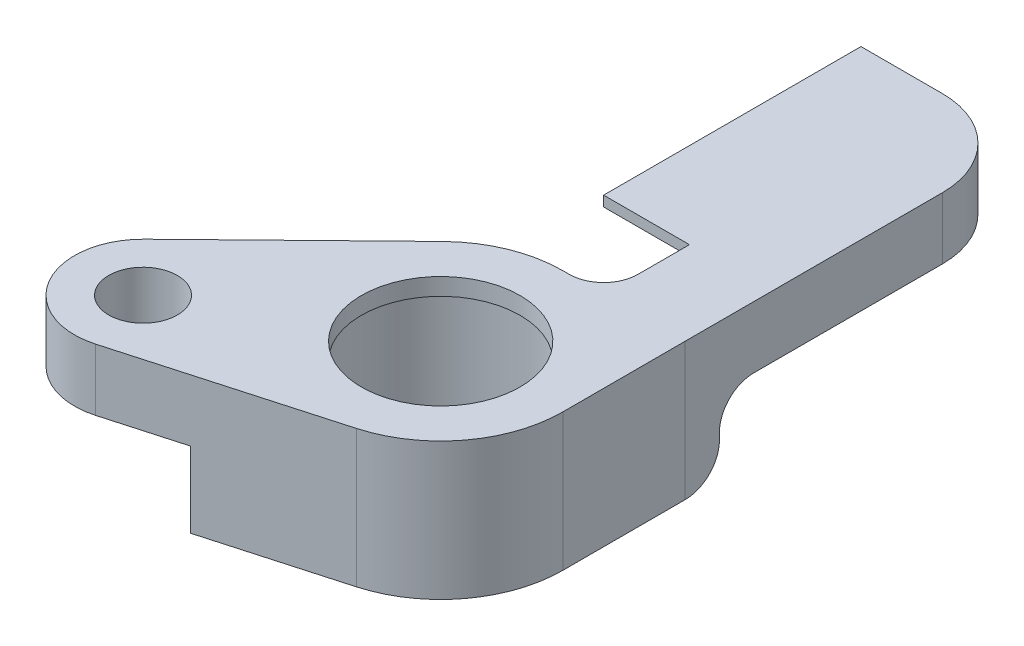
ISO-10303-21;
HEADER;
FILE_DESCRIPTION(('STEP AP214'),'2;1');
FILE_NAME('part.step','',(''),(''),'','','');
FILE_SCHEMA(('AUTOMOTIVE_DESIGN { 1 0 10303 214 1 1 1 1 }'));
ENDSEC;
DATA;
#1=APPLICATION_CONTEXT('core data for automotive mechanical design processes');
#2=APPLICATION_PROTOCOL_DEFINITION('international standard','automotive_design',2000,#1);
#3=PRODUCT_CONTEXT('',#1,'mechanical');
#4=PRODUCT('Part','Part','',(#3));
#5=PRODUCT_RELATED_PRODUCT_CATEGORY('part','',(#4));
#6=PRODUCT_DEFINITION_FORMATION('','',#4);
#7=PRODUCT_DEFINITION_CONTEXT('part definition',#1,'design');
#8=PRODUCT_DEFINITION('design','',#6,#7);
#9=PRODUCT_DEFINITION_SHAPE('','',#8);
#10=(LENGTH_UNIT() NAMED_UNIT(*) SI_UNIT(.MILLI.,.METRE.));
#11=(NAMED_UNIT(*) PLANE_ANGLE_UNIT() SI_UNIT($,.RADIAN.));
#12=(NAMED_UNIT(*) SI_UNIT($,.STERADIAN.) SOLID_ANGLE_UNIT());
#13=UNCERTAINTY_MEASURE_WITH_UNIT(LENGTH_MEASURE(1.E-05),#10,'distance_accuracy_value','');
#14=(GEOMETRIC_REPRESENTATION_CONTEXT(3) GLOBAL_UNCERTAINTY_ASSIGNED_CONTEXT((#13)) GLOBAL_UNIT_ASSIGNED_CONTEXT((#10,
#11,#12)) REPRESENTATION_CONTEXT('',''));
#15=CARTESIAN_POINT('',(0.,0.,0.));
#16=DIRECTION('',(0.,0.,1.));
#17=DIRECTION('',(1.,0.,0.));
#18=AXIS2_PLACEMENT_3D('',#15,#16,#17);
#19=CARTESIAN_POINT('',(0.,16.,0.));
#20=DIRECTION('',(0.,-1.,0.));
#21=DIRECTION('',(0.,0.,-1.));
#22=AXIS2_PLACEMENT_3D('',#19,#20,#21);
#23=CYLINDRICAL_SURFACE('',#22,8.);
#24=CARTESIAN_POINT('',(0.,8.8,0.));
#25=DIRECTION('',(0.,-1.,0.));
#26=DIRECTION('',(0.,0.,-1.));
#27=AXIS2_PLACEMENT_3D('',#24,#25,#26);
#28=CIRCLE('',#27,8.);
#29=CARTESIAN_POINT('',(2.1725034572511,8.8,7.69936547568902));
#30=VERTEX_POINT('',#29);
#31=CARTESIAN_POINT('',(-5.58159436634202,8.8,-5.73112592163348));
#32=VERTEX_POINT('',#31);
#33=EDGE_CURVE('E229',#30,#32,#28,.T.);
#34=ORIENTED_EDGE('',*,*,#33,.F.);
#35=DIRECTION('',(0.,-1.,0.));
#36=VECTOR('',#35,1.);
#37=CARTESIAN_POINT('',(2.1725034572511,16.,7.69936547568901));
#38=LINE('',#37,#36);
#39=CARTESIAN_POINT('',(2.1725034572511,16.,7.69936547568901));
#40=VERTEX_POINT('',#39);
#41=EDGE_CURVE('E283',#40,#30,#38,.T.);
#42=ORIENTED_EDGE('',*,*,#41,.F.);
#43=CARTESIAN_POINT('',(0.,16.,0.));
#44=DIRECTION('',(0.,1.,0.));
#45=DIRECTION('',(0.,0.,1.));
#46=AXIS2_PLACEMENT_3D('',#43,#44,#45);
#47=CIRCLE('',#46,8.);
#48=CARTESIAN_POINT('',(-5.58159436634201,16.,-5.73112592163347));
#49=VERTEX_POINT('',#48);
#50=EDGE_CURVE('E250',#49,#40,#47,.T.);
#51=ORIENTED_EDGE('',*,*,#50,.F.);
#52=DIRECTION('',(0.,-1.,0.));
#53=VECTOR('',#52,1.);
#54=CARTESIAN_POINT('',(-5.58159436634201,16.,-5.73112592163347));
#55=LINE('',#54,#53);
#56=EDGE_CURVE('E286',#49,#32,#55,.T.);
#57=ORIENTED_EDGE('',*,*,#56,.T.);
#58=EDGE_LOOP('',(#34,#42,#51,#57));
#59=FACE_BOUND('',#58,.T.);
#60=ADVANCED_FACE('F35',(#59),#23,.T.);
#61=CARTESIAN_POINT('',(26.7433238904043,16.,-26.9517059221718));
#62=DIRECTION('',(1.,0.,0.));
#63=DIRECTION('',(0.,0.,-1.));
#64=AXIS2_PLACEMENT_3D('',#61,#62,#63);
#65=PLANE('',#64);
#66=DIRECTION('',(0.,0.,-1.));
#67=VECTOR('',#66,1.);
#68=CARTESIAN_POINT('',(26.7433238904043,14.8,-36.9517059221718));
#69=LINE('',#68,#67);
#70=CARTESIAN_POINT('',(26.7433238904043,14.8,-36.9517059221718));
#71=VERTEX_POINT('',#70);
#72=CARTESIAN_POINT('',(26.7433238904043,14.8,-66.9391980998909));
#73=VERTEX_POINT('',#72);
#74=EDGE_CURVE('E181',#71,#73,#69,.T.);
#75=ORIENTED_EDGE('',*,*,#74,.T.);
#76=DIRECTION('',(0.,-1.,0.));
#77=VECTOR('',#76,1.);
#78=CARTESIAN_POINT('',(26.7433238904043,14.8,-66.9391980998909));
#79=LINE('',#78,#77);
#80=CARTESIAN_POINT('',(26.7433238904043,8.8,-66.9391980998909));
#81=VERTEX_POINT('',#80);
#82=EDGE_CURVE('E462',#73,#81,#79,.T.);
#83=ORIENTED_EDGE('',*,*,#82,.T.);
#84=DIRECTION('',(0.,0.,-1.));
#85=VECTOR('',#84,1.);
#86=CARTESIAN_POINT('',(26.7433238904043,8.8,-66.9517059221718));
#87=LINE('',#86,#85);
#88=CARTESIAN_POINT('',(26.7433238904043,8.8,-34.9517059221718));
#89=VERTEX_POINT('',#88);
#90=EDGE_CURVE('E449',#89,#81,#87,.T.);
#91=ORIENTED_EDGE('',*,*,#90,.F.);
#92=CARTESIAN_POINT('',(26.7433238904043,4.8,-34.9517059221718));
#93=DIRECTION('',(1.,0.,0.));
#94=DIRECTION('',(0.,0.,-1.));
#95=AXIS2_PLACEMENT_3D('',#92,#93,#94);
#96=CIRCLE('',#95,4.);
#97=CARTESIAN_POINT('',(26.7433238904043,4.8,-30.9517059221718));
#98=VERTEX_POINT('',#97);
#99=EDGE_CURVE('E447',#89,#98,#96,.T.);
#100=ORIENTED_EDGE('',*,*,#99,.T.);
#101=DIRECTION('',(0.,-1.,0.));
#102=VECTOR('',#101,1.);
#103=CARTESIAN_POINT('',(26.7433238904043,16.,-30.9517059221718));
#104=LINE('',#103,#102);
#105=CARTESIAN_POINT('',(26.7433238904043,16.,-30.9517059221718));
#106=VERTEX_POINT('',#105);
#107=EDGE_CURVE('E300',#98,#106,#104,.F.);
#108=ORIENTED_EDGE('',*,*,#107,.T.);
#109=DIRECTION('',(0.,0.,1.));
#110=VECTOR('',#109,1.);
#111=CARTESIAN_POINT('',(26.7433238904043,16.,-26.9517059221718));
#112=LINE('',#111,#110);
#113=CARTESIAN_POINT('',(26.7433238904043,16.,-36.9517059221718));
#114=VERTEX_POINT('',#113);
#115=EDGE_CURVE('E240',#114,#106,#112,.T.);
#116=ORIENTED_EDGE('',*,*,#115,.F.);
#117=DIRECTION('',(0.,1.,0.));
#118=VECTOR('',#117,1.);
#119=CARTESIAN_POINT('',(26.7433238904043,14.8,-36.9517059221718));
#120=LINE('',#119,#118);
#121=EDGE_CURVE('E202',#71,#114,#120,.T.);
#122=ORIENTED_EDGE('',*,*,#121,.F.);
#123=EDGE_LOOP('',(#75,#83,#91,#100,#108,#116,#122));
#124=FACE_BOUND('',#123,.T.);
#125=ADVANCED_FACE('F329',(#124),#65,.F.);
#126=CARTESIAN_POINT('',(26.7433238904043,16.,-26.9517059221718));
#127=DIRECTION('',(0.,0.,1.));
#128=DIRECTION('',(1.,0.,0.));
#129=AXIS2_PLACEMENT_3D('',#126,#127,#128);
#130=PLANE('',#129);
#131=DIRECTION('',(-1.,0.,0.));
#132=VECTOR('',#131,1.);
#133=CARTESIAN_POINT('',(26.7433238904043,16.,-26.9517059221718));
#134=LINE('',#133,#132);
#135=CARTESIAN_POINT('',(22.7433238904043,16.,-26.9517059221718));
#136=VERTEX_POINT('',#135);
#137=CARTESIAN_POINT('',(22.,16.,-26.9517059221718));
#138=VERTEX_POINT('',#137);
#139=EDGE_CURVE('E243',#136,#138,#134,.T.);
#140=ORIENTED_EDGE('',*,*,#139,.F.);
#141=DIRECTION('',(0.,-1.,0.));
#142=VECTOR('',#141,1.);
#143=CARTESIAN_POINT('',(22.7433238904043,0.,-26.9517059221718));
#144=LINE('',#143,#142);
#145=CARTESIAN_POINT('',(22.7433238904043,0.,-26.9517059221718));
#146=VERTEX_POINT('',#145);
#147=EDGE_CURVE('E297',#136,#146,#144,.T.);
#148=ORIENTED_EDGE('',*,*,#147,.T.);
#149=DIRECTION('',(-1.,0.,0.));
#150=VECTOR('',#149,1.);
#151=CARTESIAN_POINT('',(26.7433238904043,0.,-26.9517059221718));
#152=LINE('',#151,#150);
#153=CARTESIAN_POINT('',(22.,0.,-26.9517059221718));
#154=VERTEX_POINT('',#153);
#155=EDGE_CURVE('E237',#146,#154,#152,.T.);
#156=ORIENTED_EDGE('',*,*,#155,.T.);
#157=DIRECTION('',(0.,-1.,0.));
#158=VECTOR('',#157,1.);
#159=CARTESIAN_POINT('',(22.,16.,-26.9517059221718));
#160=LINE('',#159,#158);
#161=EDGE_CURVE('E292',#138,#154,#160,.T.);
#162=ORIENTED_EDGE('',*,*,#161,.F.);
#163=EDGE_LOOP('',(#140,#148,#156,#162));
#164=FACE_BOUND('',#163,.T.);
#165=ADVANCED_FACE('F332',(#164),#130,.F.);
#166=CARTESIAN_POINT('',(22.,16.,-12.7017059221718));
#167=DIRECTION('',(0.,-1.,0.));
#168=DIRECTION('',(0.,0.,-1.));
#169=AXIS2_PLACEMENT_3D('',#166,#167,#168);
#170=CYLINDRICAL_SURFACE('',#169,14.25);
#171=CARTESIAN_POINT('',(22.,0.,-12.7017059221718));
#172=DIRECTION('',(0.,1.,0.));
#173=DIRECTION('',(0.,0.,1.));
#174=AXIS2_PLACEMENT_3D('',#171,#172,#173);
#175=CIRCLE('',#174,14.25);
#176=CARTESIAN_POINT('',(12.0577850349533,0.,-22.9102739700814));
#177=VERTEX_POINT('',#176);
#178=EDGE_CURVE('E264',#154,#177,#175,.T.);
#179=ORIENTED_EDGE('',*,*,#178,.T.);
#180=DIRECTION('',(0.,-1.,0.));
#181=VECTOR('',#180,1.);
#182=CARTESIAN_POINT('',(12.0577850349533,16.,-22.9102739700814));
#183=LINE('',#182,#181);
#184=CARTESIAN_POINT('',(12.0577850349533,16.,-22.9102739700814));
#185=VERTEX_POINT('',#184);
#186=EDGE_CURVE('E289',#185,#177,#183,.T.);
#187=ORIENTED_EDGE('',*,*,#186,.F.);
#188=CARTESIAN_POINT('',(22.,16.,-12.7017059221718));
#189=DIRECTION('',(0.,1.,0.));
#190=DIRECTION('',(0.,0.,1.));
#191=AXIS2_PLACEMENT_3D('',#188,#189,#190);
#192=CIRCLE('',#191,14.25);
#193=EDGE_CURVE('E246',#138,#185,#192,.T.);
#194=ORIENTED_EDGE('',*,*,#193,.F.);
#195=ORIENTED_EDGE('',*,*,#161,.T.);
#196=EDGE_LOOP('',(#179,#187,#194,#195));
#197=FACE_BOUND('',#196,.T.);
#198=ADVANCED_FACE('F336',(#197),#170,.T.);
#199=CARTESIAN_POINT('',(12.0577850349533,16.,-22.9102739700814));
#200=DIRECTION('',(0.697699295792752,0.,0.716390740204184));
#201=DIRECTION('',(0.716390740204184,0.,-0.697699295792752));
#202=AXIS2_PLACEMENT_3D('',#199,#200,#201);
#203=PLANE('',#202);
#204=DIRECTION('',(-0.716390740204184,0.,0.697699295792752));
#205=VECTOR('',#204,1.);
#206=CARTESIAN_POINT('',(12.0577850349533,0.,-22.9102739700814));
#207=LINE('',#206,#205);
#208=CARTESIAN_POINT('',(0.825999207849776,0.,-11.9715381346188));
#209=VERTEX_POINT('',#208);
#210=EDGE_CURVE('E266',#177,#209,#207,.T.);
#211=ORIENTED_EDGE('',*,*,#210,.T.);
#212=DIRECTION('',(0.,-1.,0.));
#213=VECTOR('',#212,1.);
#214=CARTESIAN_POINT('',(0.825999207849776,8.8,-11.9715381346188));
#215=LINE('',#214,#213);
#216=CARTESIAN_POINT('',(0.825999207849776,8.8,-11.9715381346188));
#217=VERTEX_POINT('',#216);
#218=EDGE_CURVE('E226',#209,#217,#215,.F.);
#219=ORIENTED_EDGE('',*,*,#218,.T.);
#220=DIRECTION('',(0.716390740204184,0.,-0.697699295792752));
#221=VECTOR('',#220,1.);
#222=CARTESIAN_POINT('',(12.0577850349533,8.8,-22.9102739700814));
#223=LINE('',#222,#221);
#224=EDGE_CURVE('E231',#32,#217,#223,.T.);
#225=ORIENTED_EDGE('',*,*,#224,.F.);
#226=ORIENTED_EDGE('',*,*,#56,.F.);
#227=DIRECTION('',(-0.716390740204184,0.,0.697699295792752));
#228=VECTOR('',#227,1.);
#229=CARTESIAN_POINT('',(12.0577850349533,16.,-22.9102739700814));
#230=LINE('',#229,#228);
#231=EDGE_CURVE('E248',#185,#49,#230,.T.);
#232=ORIENTED_EDGE('',*,*,#231,.F.);
#233=ORIENTED_EDGE('',*,*,#186,.T.);
#234=EDGE_LOOP('',(#211,#219,#225,#226,#232,#233));
#235=FACE_BOUND('',#234,.T.);
#236=ADVANCED_FACE('F340',(#235),#203,.F.);
#237=CARTESIAN_POINT('',(2.17250345725111,16.,7.69936547568902));
#238=DIRECTION('',(-0.271562932156388,0.,-0.962420684461127));
#239=DIRECTION('',(-0.962420684461127,0.,0.271562932156388));
#240=AXIS2_PLACEMENT_3D('',#237,#238,#239);
#241=PLANE('',#240);
#242=DIRECTION('',(-0.962420684461127,0.,0.271562932156388));
#243=VECTOR('',#242,1.);
#244=CARTESIAN_POINT('',(2.17250345725111,8.8,7.69936547568902));
#245=LINE('',#244,#243);
#246=CARTESIAN_POINT('',(10.7806557508789,8.8,5.27043276980563));
#247=VERTEX_POINT('',#246);
#248=EDGE_CURVE('E295',#247,#30,#245,.T.);
#249=ORIENTED_EDGE('',*,*,#248,.F.);
#250=DIRECTION('',(0.,-1.,0.));
#251=VECTOR('',#250,1.);
#252=CARTESIAN_POINT('',(10.7806557508789,8.8,5.27043276980563));
#253=LINE('',#252,#251);
#254=CARTESIAN_POINT('',(10.7806557508789,0.,5.27043276980563));
#255=VERTEX_POINT('',#254);
#256=EDGE_CURVE('E222',#247,#255,#253,.T.);
#257=ORIENTED_EDGE('',*,*,#256,.T.);
#258=DIRECTION('',(0.962420684461127,0.,-0.271562932156388));
#259=VECTOR('',#258,1.);
#260=CARTESIAN_POINT('',(2.17250345725111,0.,7.69936547568902));
#261=LINE('',#260,#259);
#262=CARTESIAN_POINT('',(25.8697717832285,0.,1.01278883139926));
#263=VERTEX_POINT('',#262);
#264=EDGE_CURVE('E269',#255,#263,#261,.T.);
#265=ORIENTED_EDGE('',*,*,#264,.T.);
#266=DIRECTION('',(0.,-1.,0.));
#267=VECTOR('',#266,1.);
#268=CARTESIAN_POINT('',(25.8697717832285,16.,1.01278883139926));
#269=LINE('',#268,#267);
#270=CARTESIAN_POINT('',(25.8697717832285,16.,1.01278883139926));
#271=VERTEX_POINT('',#270);
#272=EDGE_CURVE('E280',#271,#263,#269,.T.);
#273=ORIENTED_EDGE('',*,*,#272,.F.);
#274=DIRECTION('',(0.962420684461127,0.,-0.271562932156388));
#275=VECTOR('',#274,1.);
#276=CARTESIAN_POINT('',(2.17250345725111,16.,7.69936547568902));
#277=LINE('',#276,#275);
#278=EDGE_CURVE('E252',#40,#271,#277,.T.);
#279=ORIENTED_EDGE('',*,*,#278,.F.);
#280=ORIENTED_EDGE('',*,*,#41,.T.);
#281=EDGE_LOOP('',(#249,#257,#265,#273,#279,#280));
#282=FACE_BOUND('',#281,.T.);
#283=ADVANCED_FACE('F344',(#282),#241,.F.);
#284=CARTESIAN_POINT('',(22.,16.,-12.7017059221718));
#285=DIRECTION('',(0.,-1.,0.));
#286=DIRECTION('',(0.,0.,-1.));
#287=AXIS2_PLACEMENT_3D('',#284,#285,#286);
#288=CYLINDRICAL_SURFACE('',#287,14.25);
#289=CARTESIAN_POINT('',(22.,0.,-12.7017059221718));
#290=DIRECTION('',(0.,1.,0.));
#291=DIRECTION('',(0.,0.,1.));
#292=AXIS2_PLACEMENT_3D('',#289,#290,#291);
#293=CIRCLE('',#292,14.25);
#294=CARTESIAN_POINT('',(36.2499984353921,0.,-12.7083835956424));
#295=VERTEX_POINT('',#294);
#296=EDGE_CURVE('E271',#263,#295,#293,.T.);
#297=ORIENTED_EDGE('',*,*,#296,.T.);
#298=DIRECTION('',(0.,-1.,0.));
#299=VECTOR('',#298,1.);
#300=CARTESIAN_POINT('',(36.2499984353921,16.,-12.7083835956424));
#301=LINE('',#300,#299);
#302=CARTESIAN_POINT('',(36.2499984353921,16.,-12.7083835956424));
#303=VERTEX_POINT('',#302);
#304=EDGE_CURVE('E277',#303,#295,#301,.T.);
#305=ORIENTED_EDGE('',*,*,#304,.F.);
#306=CARTESIAN_POINT('',(22.,16.,-12.7017059221718));
#307=DIRECTION('',(0.,1.,0.));
#308=DIRECTION('',(0.,0.,1.));
#309=AXIS2_PLACEMENT_3D('',#306,#307,#308);
#310=CIRCLE('',#309,14.25);
#311=EDGE_CURVE('E254',#271,#303,#310,.T.);
#312=ORIENTED_EDGE('',*,*,#311,.F.);
#313=ORIENTED_EDGE('',*,*,#272,.T.);
#314=EDGE_LOOP('',(#297,#305,#312,#313));
#315=FACE_BOUND('',#314,.T.);
#316=ADVANCED_FACE('F351',(#315),#288,.T.);
#317=CARTESIAN_POINT('',(36.2499984353921,16.,-12.7083835956424));
#318=DIRECTION('',(-0.999999890202954,0.,0.000468608664601455));
#319=DIRECTION('',(0.000468608664601455,0.,0.999999890202954));
#320=AXIS2_PLACEMENT_3D('',#317,#318,#319);
#321=PLANE('',#320);
#322=DIRECTION('',(-0.000468608664601455,0.,-0.999999890202954));
#323=VECTOR('',#322,1.);
#324=CARTESIAN_POINT('',(36.2499984353921,0.,-12.7083835956424));
#325=LINE('',#324,#323);
#326=CARTESIAN_POINT('',(36.2433238904043,0.,-26.9517059221718));
#327=VERTEX_POINT('',#326);
#328=EDGE_CURVE('E244',#295,#327,#325,.T.);
#329=ORIENTED_EDGE('',*,*,#328,.T.);
#330=DIRECTION('',(0.,-1.,0.));
#331=VECTOR('',#330,1.);
#332=CARTESIAN_POINT('',(36.2433238904043,16.,-26.9517059221718));
#333=LINE('',#332,#331);
#334=CARTESIAN_POINT('',(36.2433238904043,16.,-26.9517059221718));
#335=VERTEX_POINT('',#334);
#336=EDGE_CURVE('E262',#335,#327,#333,.T.);
#337=ORIENTED_EDGE('',*,*,#336,.F.);
#338=DIRECTION('',(-0.000468608664601455,0.,-0.999999890202954));
#339=VECTOR('',#338,1.);
#340=CARTESIAN_POINT('',(36.2499984353921,16.,-12.7083835956424));
#341=LINE('',#340,#339);
#342=EDGE_CURVE('E256',#303,#335,#341,.T.);
#343=ORIENTED_EDGE('',*,*,#342,.F.);
#344=ORIENTED_EDGE('',*,*,#304,.T.);
#345=EDGE_LOOP('',(#329,#337,#343,#344));
#346=FACE_BOUND('',#345,.T.);
#347=ADVANCED_FACE('F355',(#346),#321,.F.);
#348=CARTESIAN_POINT('',(36.2433238904043,16.,-66.9517059221718));
#349=DIRECTION('',(-1.,0.,0.));
#350=DIRECTION('',(0.,0.,1.));
#351=AXIS2_PLACEMENT_3D('',#348,#349,#350);
#352=PLANE('',#351);
#353=DIRECTION('',(0.,0.,1.));
#354=VECTOR('',#353,1.);
#355=CARTESIAN_POINT('',(36.2433238904043,8.8,-66.9517059221718));
#356=LINE('',#355,#354);
#357=CARTESIAN_POINT('',(36.2433238904043,8.8,-56.9517059221718));
#358=VERTEX_POINT('',#357);
#359=CARTESIAN_POINT('',(36.2433238904043,8.8,-34.9517059221718));
#360=VERTEX_POINT('',#359);
#361=EDGE_CURVE('E421',#358,#360,#356,.T.);
#362=ORIENTED_EDGE('',*,*,#361,.F.);
#363=DIRECTION('',(0.,-1.,0.));
#364=VECTOR('',#363,1.);
#365=CARTESIAN_POINT('',(36.2433238904043,16.,-56.9517059221718));
#366=LINE('',#365,#364);
#367=CARTESIAN_POINT('',(36.2433238904043,16.,-56.9517059221718));
#368=VERTEX_POINT('',#367);
#369=EDGE_CURVE('E43',#358,#368,#366,.F.);
#370=ORIENTED_EDGE('',*,*,#369,.T.);
#371=DIRECTION('',(0.,0.,-1.));
#372=VECTOR('',#371,1.);
#373=CARTESIAN_POINT('',(36.2433238904043,16.,-66.9517059221718));
#374=LINE('',#373,#372);
#375=EDGE_CURVE('E258',#335,#368,#374,.T.);
#376=ORIENTED_EDGE('',*,*,#375,.F.);
#377=ORIENTED_EDGE('',*,*,#336,.T.);
#378=CARTESIAN_POINT('',(36.2433238904043,4.,-26.9517059221718));
#379=DIRECTION('',(-1.,0.,0.));
#380=DIRECTION('',(0.,0.,1.));
#381=AXIS2_PLACEMENT_3D('',#378,#379,#380);
#382=CIRCLE('',#381,4.);
#383=CARTESIAN_POINT('',(36.2433238904043,4.,-30.9517059221718));
#384=VERTEX_POINT('',#383);
#385=EDGE_CURVE('E425',#327,#384,#382,.F.);
#386=ORIENTED_EDGE('',*,*,#385,.T.);
#387=DIRECTION('',(0.,-1.,0.));
#388=VECTOR('',#387,1.);
#389=CARTESIAN_POINT('',(36.2433238904043,52.0323783822629,-30.9517059221718));
#390=LINE('',#389,#388);
#391=CARTESIAN_POINT('',(36.2433238904043,4.8,-30.9517059221718));
#392=VERTEX_POINT('',#391);
#393=EDGE_CURVE('E200',#392,#384,#390,.T.);
#394=ORIENTED_EDGE('',*,*,#393,.F.);
#395=CARTESIAN_POINT('',(36.2433238904043,4.8,-34.9517059221718));
#396=DIRECTION('',(-1.,0.,0.));
#397=DIRECTION('',(0.,0.,1.));
#398=AXIS2_PLACEMENT_3D('',#395,#396,#397);
#399=CIRCLE('',#398,4.);
#400=EDGE_CURVE('E453',#392,#360,#399,.T.);
#401=ORIENTED_EDGE('',*,*,#400,.T.);
#402=EDGE_LOOP('',(#362,#370,#376,#377,#386,#394,#401));
#403=FACE_BOUND('',#402,.T.);
#404=ADVANCED_FACE('F359',(#403),#352,.F.);
#405=CARTESIAN_POINT('',(26.7433238904043,16.,-66.9517059221718));
#406=DIRECTION('',(0.,0.,1.));
#407=DIRECTION('',(1.,0.,0.));
#408=AXIS2_PLACEMENT_3D('',#405,#406,#407);
#409=PLANE('',#408);
#410=DIRECTION('',(-1.,0.,0.));
#411=VECTOR('',#410,1.);
#412=CARTESIAN_POINT('',(26.7433238904043,16.,-66.9517059221718));
#413=LINE('',#412,#411);
#414=CARTESIAN_POINT('',(26.2433238904043,16.,-66.9517059221718));
#415=VERTEX_POINT('',#414);
#416=CARTESIAN_POINT('',(16.7433238904043,16.,-66.9517059221718));
#417=VERTEX_POINT('',#416);
#418=EDGE_CURVE('E260',#415,#417,#413,.T.);
#419=ORIENTED_EDGE('',*,*,#418,.F.);
#420=DIRECTION('',(0.,-1.,0.));
#421=VECTOR('',#420,1.);
#422=CARTESIAN_POINT('',(26.2433238904043,16.,-66.9517059221718));
#423=LINE('',#422,#421);
#424=CARTESIAN_POINT('',(26.2433238904043,14.8,-66.9517059221718));
#425=VERTEX_POINT('',#424);
#426=EDGE_CURVE('E177',#415,#425,#423,.T.);
#427=ORIENTED_EDGE('',*,*,#426,.T.);
#428=DIRECTION('',(-1.,0.,0.));
#429=VECTOR('',#428,1.);
#430=CARTESIAN_POINT('',(26.7433238904043,14.8,-66.9517059221718));
#431=LINE('',#430,#429);
#432=CARTESIAN_POINT('',(16.7433238904043,14.8,-66.9517059221718));
#433=VERTEX_POINT('',#432);
#434=EDGE_CURVE('E170',#425,#433,#431,.T.);
#435=ORIENTED_EDGE('',*,*,#434,.T.);
#436=DIRECTION('',(0.,1.,0.));
#437=VECTOR('',#436,1.);
#438=CARTESIAN_POINT('',(16.7433238904043,14.8,-66.9517059221718));
#439=LINE('',#438,#437);
#440=EDGE_CURVE('E174',#433,#417,#439,.T.);
#441=ORIENTED_EDGE('',*,*,#440,.T.);
#442=EDGE_LOOP('',(#419,#427,#435,#441));
#443=FACE_BOUND('',#442,.T.);
#444=ADVANCED_FACE('F173',(#443),#409,.F.);
#445=CARTESIAN_POINT('',(22.,16.,-12.7017059221718));
#446=DIRECTION('',(0.,1.,0.));
#447=DIRECTION('',(0.,0.,1.));
#448=AXIS2_PLACEMENT_3D('',#445,#446,#447);
#449=PLANE('',#448);
#450=CARTESIAN_POINT('',(0.,16.,0.));
#451=DIRECTION('',(0.,-1.,0.));
#452=DIRECTION('',(0.,0.,-1.));
#453=AXIS2_PLACEMENT_3D('',#450,#451,#452);
#454=CIRCLE('',#453,4.);
#455=CARTESIAN_POINT('',(0.,16.,-4.));
#456=VERTEX_POINT('',#455);
#457=EDGE_CURVE('E207',#456,#456,#454,.T.);
#458=ORIENTED_EDGE('',*,*,#457,.T.);
#459=EDGE_LOOP('',(#458));
#460=FACE_BOUND('',#459,.T.);
#461=CARTESIAN_POINT('',(22.,16.,-12.7017059221718));
#462=DIRECTION('',(0.,-1.,0.));
#463=DIRECTION('',(0.,0.,-1.));
#464=AXIS2_PLACEMENT_3D('',#461,#462,#463);
#465=CIRCLE('',#464,9.25);
#466=CARTESIAN_POINT('',(22.,16.,-21.9517059221718));
#467=VERTEX_POINT('',#466);
#468=EDGE_CURVE('E213',#467,#467,#465,.T.);
#469=ORIENTED_EDGE('',*,*,#468,.T.);
#470=EDGE_LOOP('',(#469));
#471=FACE_BOUND('',#470,.T.);
#472=ORIENTED_EDGE('',*,*,#375,.T.);
#473=CARTESIAN_POINT('',(26.2433238904043,16.,-56.9517059221718));
#474=DIRECTION('',(0.,1.,0.));
#475=DIRECTION('',(0.,0.,1.));
#476=AXIS2_PLACEMENT_3D('',#473,#474,#475);
#477=CIRCLE('',#476,10.);
#478=EDGE_CURVE('E13',#368,#415,#477,.T.);
#479=ORIENTED_EDGE('',*,*,#478,.T.);
#480=ORIENTED_EDGE('',*,*,#418,.T.);
#481=DIRECTION('',(0.,0.,1.));
#482=VECTOR('',#481,1.);
#483=CARTESIAN_POINT('',(16.7433238904043,16.,-66.9517059221718));
#484=LINE('',#483,#482);
#485=CARTESIAN_POINT('',(16.7433238904043,16.,-36.9517059221718));
#486=VERTEX_POINT('',#485);
#487=EDGE_CURVE('E188',#417,#486,#484,.T.);
#488=ORIENTED_EDGE('',*,*,#487,.T.);
#489=DIRECTION('',(1.,0.,0.));
#490=VECTOR('',#489,1.);
#491=CARTESIAN_POINT('',(16.7433238904043,16.,-36.9517059221718));
#492=LINE('',#491,#490);
#493=EDGE_CURVE('E199',#486,#114,#492,.T.);
#494=ORIENTED_EDGE('',*,*,#493,.T.);
#495=ORIENTED_EDGE('',*,*,#115,.T.);
#496=CARTESIAN_POINT('',(22.7433238904043,16.,-30.9517059221718));
#497=DIRECTION('',(0.,1.,0.));
#498=DIRECTION('',(0.,0.,1.));
#499=AXIS2_PLACEMENT_3D('',#496,#497,#498);
#500=CIRCLE('',#499,4.);
#501=EDGE_CURVE('E304',#106,#136,#500,.F.);
#502=ORIENTED_EDGE('',*,*,#501,.T.);
#503=ORIENTED_EDGE('',*,*,#139,.T.);
#504=ORIENTED_EDGE('',*,*,#193,.T.);
#505=ORIENTED_EDGE('',*,*,#231,.T.);
#506=ORIENTED_EDGE('',*,*,#50,.T.);
#507=ORIENTED_EDGE('',*,*,#278,.T.);
#508=ORIENTED_EDGE('',*,*,#311,.T.);
#509=ORIENTED_EDGE('',*,*,#342,.T.);
#510=EDGE_LOOP('',(#472,#479,#480,#488,#494,#495,#502,#503,#504,#505,#506,#507,#508,#509));
#511=FACE_BOUND('',#510,.T.);
#512=ADVANCED_FACE('F365',(#460,#471,#511),#449,.T.);
#513=CARTESIAN_POINT('',(22.,0.,-12.7017059221718));
#514=DIRECTION('',(0.,1.,0.));
#515=DIRECTION('',(0.,0.,1.));
#516=AXIS2_PLACEMENT_3D('',#513,#514,#515);
#517=PLANE('',#516);
#518=CARTESIAN_POINT('',(22.,0.,-12.7017059221718));
#519=DIRECTION('',(0.,-1.,0.));
#520=DIRECTION('',(0.,0.,-1.));
#521=AXIS2_PLACEMENT_3D('',#518,#519,#520);
#522=CIRCLE('',#521,11.25);
#523=CARTESIAN_POINT('',(22.,0.,-23.9517059221718));
#524=VERTEX_POINT('',#523);
#525=EDGE_CURVE('E233',#524,#524,#522,.T.);
#526=ORIENTED_EDGE('',*,*,#525,.F.);
#527=EDGE_LOOP('',(#526));
#528=FACE_BOUND('',#527,.T.);
#529=ORIENTED_EDGE('',*,*,#155,.F.);
#530=DIRECTION('',(-1.,0.,0.));
#531=VECTOR('',#530,1.);
#532=CARTESIAN_POINT('',(22.,0.,-26.9517059221718));
#533=LINE('',#532,#531);
#534=EDGE_CURVE('E318',#146,#327,#533,.F.);
#535=ORIENTED_EDGE('',*,*,#534,.T.);
#536=ORIENTED_EDGE('',*,*,#328,.F.);
#537=ORIENTED_EDGE('',*,*,#296,.F.);
#538=ORIENTED_EDGE('',*,*,#264,.F.);
#539=CARTESIAN_POINT('',(0.,0.,0.));
#540=DIRECTION('',(0.,-1.,0.));
#541=DIRECTION('',(0.,0.,-1.));
#542=AXIS2_PLACEMENT_3D('',#539,#540,#541);
#543=CIRCLE('',#542,12.);
#544=EDGE_CURVE('E216',#209,#255,#543,.T.);
#545=ORIENTED_EDGE('',*,*,#544,.F.);
#546=ORIENTED_EDGE('',*,*,#210,.F.);
#547=ORIENTED_EDGE('',*,*,#178,.F.);
#548=EDGE_LOOP('',(#529,#535,#536,#537,#538,#545,#546,#547));
#549=FACE_BOUND('',#548,.T.);
#550=ADVANCED_FACE('F366',(#528,#549),#517,.F.);
#551=CARTESIAN_POINT('',(22.,14.,-12.7017059221718));
#552=DIRECTION('',(0.,-1.,0.));
#553=DIRECTION('',(0.,0.,-1.));
#554=AXIS2_PLACEMENT_3D('',#551,#552,#553);
#555=CYLINDRICAL_SURFACE('',#554,11.25);
#556=CARTESIAN_POINT('',(22.,14.,-12.7017059221718));
#557=DIRECTION('',(0.,-1.,0.));
#558=DIRECTION('',(0.,0.,-1.));
#559=AXIS2_PLACEMENT_3D('',#556,#557,#558);
#560=CIRCLE('',#559,11.25);
#561=CARTESIAN_POINT('',(22.,14.,-23.9517059221718));
#562=VERTEX_POINT('',#561);
#563=EDGE_CURVE('E234',#562,#562,#560,.T.);
#564=ORIENTED_EDGE('',*,*,#563,.F.);
#565=EDGE_LOOP('',(#564));
#566=FACE_BOUND('',#565,.T.);
#567=ORIENTED_EDGE('',*,*,#525,.T.);
#568=EDGE_LOOP('',(#567));
#569=FACE_BOUND('',#568,.T.);
#570=ADVANCED_FACE('F369',(#566,#569),#555,.F.);
#571=CARTESIAN_POINT('',(22.,14.,-12.7017059221718));
#572=DIRECTION('',(0.,-1.,0.));
#573=DIRECTION('',(0.,0.,-1.));
#574=AXIS2_PLACEMENT_3D('',#571,#572,#573);
#575=PLANE('',#574);
#576=CARTESIAN_POINT('',(22.,14.,-12.7017059221718));
#577=DIRECTION('',(0.,-1.,0.));
#578=DIRECTION('',(0.,0.,-1.));
#579=AXIS2_PLACEMENT_3D('',#576,#577,#578);
#580=CIRCLE('',#579,9.25);
#581=CARTESIAN_POINT('',(22.,14.,-21.9517059221718));
#582=VERTEX_POINT('',#581);
#583=EDGE_CURVE('E210',#582,#582,#580,.T.);
#584=ORIENTED_EDGE('',*,*,#583,.F.);
#585=EDGE_LOOP('',(#584));
#586=FACE_BOUND('',#585,.T.);
#587=ORIENTED_EDGE('',*,*,#563,.T.);
#588=EDGE_LOOP('',(#587));
#589=FACE_BOUND('',#588,.T.);
#590=ADVANCED_FACE('F376',(#586,#589),#575,.T.);
#591=CARTESIAN_POINT('',(0.,8.8,0.));
#592=DIRECTION('',(0.,-1.,0.));
#593=DIRECTION('',(0.,0.,-1.));
#594=AXIS2_PLACEMENT_3D('',#591,#592,#593);
#595=PLANE('',#594);
#596=CARTESIAN_POINT('',(0.,8.8,0.));
#597=DIRECTION('',(0.,-1.,0.));
#598=DIRECTION('',(0.,0.,-1.));
#599=AXIS2_PLACEMENT_3D('',#596,#597,#598);
#600=CIRCLE('',#599,4.);
#601=CARTESIAN_POINT('',(0.,8.8,-4.));
#602=VERTEX_POINT('',#601);
#603=EDGE_CURVE('E205',#602,#602,#600,.T.);
#604=ORIENTED_EDGE('',*,*,#603,.F.);
#605=EDGE_LOOP('',(#604));
#606=FACE_BOUND('',#605,.T.);
#607=ORIENTED_EDGE('',*,*,#224,.T.);
#608=CARTESIAN_POINT('',(0.,8.8,0.));
#609=DIRECTION('',(0.,-1.,0.));
#610=DIRECTION('',(0.,0.,-1.));
#611=AXIS2_PLACEMENT_3D('',#608,#609,#610);
#612=CIRCLE('',#611,12.);
#613=EDGE_CURVE('E219',#217,#247,#612,.T.);
#614=ORIENTED_EDGE('',*,*,#613,.T.);
#615=ORIENTED_EDGE('',*,*,#248,.T.);
#616=ORIENTED_EDGE('',*,*,#33,.T.);
#617=EDGE_LOOP('',(#607,#614,#615,#616));
#618=FACE_BOUND('',#617,.T.);
#619=ADVANCED_FACE('F380',(#606,#618),#595,.T.);
#620=CARTESIAN_POINT('',(0.,8.8,0.));
#621=DIRECTION('',(0.,-1.,0.));
#622=DIRECTION('',(0.,0.,-1.));
#623=AXIS2_PLACEMENT_3D('',#620,#621,#622);
#624=CYLINDRICAL_SURFACE('',#623,12.);
#625=ORIENTED_EDGE('',*,*,#544,.T.);
#626=ORIENTED_EDGE('',*,*,#256,.F.);
#627=ORIENTED_EDGE('',*,*,#613,.F.);
#628=ORIENTED_EDGE('',*,*,#218,.F.);
#629=EDGE_LOOP('',(#625,#626,#627,#628));
#630=FACE_BOUND('',#629,.T.);
#631=ADVANCED_FACE('F382',(#630),#624,.F.);
#632=CARTESIAN_POINT('',(22.,16.,-12.7017059221718));
#633=DIRECTION('',(0.,-1.,0.));
#634=DIRECTION('',(0.,0.,-1.));
#635=AXIS2_PLACEMENT_3D('',#632,#633,#634);
#636=CYLINDRICAL_SURFACE('',#635,9.25);
#637=ORIENTED_EDGE('',*,*,#468,.F.);
#638=EDGE_LOOP('',(#637));
#639=FACE_BOUND('',#638,.T.);
#640=ORIENTED_EDGE('',*,*,#583,.T.);
#641=EDGE_LOOP('',(#640));
#642=FACE_BOUND('',#641,.T.);
#643=ADVANCED_FACE('F385',(#639,#642),#636,.F.);
#644=CARTESIAN_POINT('',(0.,16.,0.));
#645=DIRECTION('',(0.,-1.,0.));
#646=DIRECTION('',(0.,0.,-1.));
#647=AXIS2_PLACEMENT_3D('',#644,#645,#646);
#648=CYLINDRICAL_SURFACE('',#647,4.);
#649=ORIENTED_EDGE('',*,*,#457,.F.);
#650=EDGE_LOOP('',(#649));
#651=FACE_BOUND('',#650,.T.);
#652=ORIENTED_EDGE('',*,*,#603,.T.);
#653=EDGE_LOOP('',(#652));
#654=FACE_BOUND('',#653,.T.);
#655=ADVANCED_FACE('F327',(#651,#654),#648,.F.);
#656=CARTESIAN_POINT('',(22.7433238904043,16.,-30.9517059221718));
#657=DIRECTION('',(0.,1.,0.));
#658=DIRECTION('',(0.,0.,1.));
#659=AXIS2_PLACEMENT_3D('',#656,#657,#658);
#660=CYLINDRICAL_SURFACE('',#659,4.);
#661=CARTESIAN_POINT('',(26.7433238904043,4.,-30.9517059221718));
#662=VERTEX_POINT('',#661);
#663=EDGE_CURVE('E301',#662,#98,#104,.F.);
#664=ORIENTED_EDGE('',*,*,#663,.F.);
#665=CARTESIAN_POINT('',(26.7433238904043,4.,-30.9517059221718));
#666=CARTESIAN_POINT('',(26.7432895627598,3.88864961698072,-30.9517175232444));
#667=CARTESIAN_POINT('',(26.7433228104749,3.77730086169746,-30.9470568103016));
#668=CARTESIAN_POINT('',(26.7432763880215,3.55537931997572,-30.9284742165663));
#669=CARTESIAN_POINT('',(26.7431967185404,3.44480652881712,-30.9145523921576));
#670=CARTESIAN_POINT('',(26.7426759411572,3.22501514411359,-30.8774984780018));
#671=CARTESIAN_POINT('',(26.7422341978192,3.11579927429921,-30.8543502327027));
#672=CARTESIAN_POINT('',(26.740504800733,2.89969011109007,-30.7990111353832));
#673=CARTESIAN_POINT('',(26.7392171579296,2.79279678766332,-30.7668204003631));
#674=CARTESIAN_POINT('',(26.7351553968275,2.58197596624619,-30.6935870058601));
#675=CARTESIAN_POINT('',(26.7323795895446,2.4780519797261,-30.6525343202399));
#676=CARTESIAN_POINT('',(26.7245464130402,2.27407402040516,-30.5619181122269));
#677=CARTESIAN_POINT('',(26.7194891861916,2.1740198065326,-30.5123551210426));
#678=CARTESIAN_POINT('',(26.706178907399,1.97863045373064,-30.4051781927904));
#679=CARTESIAN_POINT('',(26.6979282208415,1.88329188074794,-30.347570234747));
#680=CARTESIAN_POINT('',(26.6772195191507,1.69805718768828,-30.2248388314775));
#681=CARTESIAN_POINT('',(26.6647617739473,1.60816071887576,-30.1597158685995));
#682=CARTESIAN_POINT('',(26.6351669184913,1.43799150247627,-30.0253685806804));
#683=CARTESIAN_POINT('',(26.6182307197748,1.35748040898508,-29.9564023969912));
#684=CARTESIAN_POINT('',(26.5785631446203,1.20292442115949,-29.8130817609406));
#685=CARTESIAN_POINT('',(26.5558319009221,1.12887937876758,-29.7387274320265));
#686=CARTESIAN_POINT('',(26.503757622943,0.987982548084022,-29.5858177284127));
#687=CARTESIAN_POINT('',(26.4744230161863,0.921121750207738,-29.5072678049437));
#688=CARTESIAN_POINT('',(26.4084347267148,0.795004059894712,-29.3471969746675));
#689=CARTESIAN_POINT('',(26.371782317815,0.735745847015268,-29.2656765869472));
#690=CARTESIAN_POINT('',(26.2962303102308,0.632680772446755,-29.1123765394481));
#691=CARTESIAN_POINT('',(26.2583175984221,0.587868753847199,-29.0407833503914));
#692=CARTESIAN_POINT('',(26.1765578066882,0.504186625147465,-28.8975140084493));
#693=CARTESIAN_POINT('',(26.1327110700733,0.46531617157767,-28.8258378606011));
#694=CARTESIAN_POINT('',(26.0391053960297,0.393408213614376,-28.6834279177629));
#695=CARTESIAN_POINT('',(25.9893462889387,0.360370876676574,-28.6126941498804));
#696=CARTESIAN_POINT('',(25.8840865585106,0.299865058526048,-28.4731481295542));
#697=CARTESIAN_POINT('',(25.8285859015366,0.272396609941382,-28.4043358883707));
#698=CARTESIAN_POINT('',(25.7155232357593,0.224079029529153,-28.2734478573989));
#699=CARTESIAN_POINT('',(25.6582694384257,0.202937596650427,-28.2112131266348));
#700=CARTESIAN_POINT('',(25.5392341126484,0.164815731989254,-28.0898664908333));
#701=CARTESIAN_POINT('',(25.4774511436484,0.147836631610202,-28.0307555897444));
#702=CARTESIAN_POINT('',(25.2858525247541,0.102455432419666,-27.8589911140001));
#703=CARTESIAN_POINT('',(25.1497093896018,0.0795778594734856,-27.7518151595929));
#704=CARTESIAN_POINT('',(24.8496843751798,0.0428547766040081,-27.5458846881719));
#705=CARTESIAN_POINT('',(24.6843908009141,0.0301259379997998,-27.4490105533444));
#706=CARTESIAN_POINT('',(24.341148260839,0.012558451821536,-27.2797062812187));
#707=CARTESIAN_POINT('',(24.1631888771145,0.00772637964631576,-27.2072965544457));
#708=CARTESIAN_POINT('',(23.8813214983324,0.00322903880818544,-27.1155621326072));
#709=CARTESIAN_POINT('',(23.7803234878789,0.00221537188157625,-27.0870399379642));
#710=CARTESIAN_POINT('',(23.57636547282,0.00085537548248315,-27.038007940638));
#711=CARTESIAN_POINT('',(23.4734052943503,0.000509105427111663,-27.0174988514765));
#712=CARTESIAN_POINT('',(23.2662452535857,0.000100209643425385,-26.9846482796499));
#713=CARTESIAN_POINT('',(23.1620459997803,3.74500229504978E-05,-26.9723029438788));
#714=CARTESIAN_POINT('',(22.9530069839303,7.37778172367289E-07,-26.9558279086226));
#715=CARTESIAN_POINT('',(22.8481672641576,2.67793547332034E-05,-26.9516976726806));
#716=CARTESIAN_POINT('',(22.7433238904043,0.,-26.9517059221718));
#717=B_SPLINE_CURVE_WITH_KNOTS('',3,(#665,#666,#667,#668,#669,#670,#671,#672,#673,#674,#675,
#676,#677,#678,#679,#680,#681,#682,#683,#684,#685,#686,#687,#688,#689,#690,#691,#692,#693,#694,
#695,#696,#697,#698,#699,#700,#701,#702,#703,#704,#705,#706,#707,#708,#709,#710,#711,#712,#713,
#714,#715,#716),.UNSPECIFIED.,.F.,.F.,(4,2,2,2,2,2,2,2,2,2,2,2,2,2,2,2,2,2,2,2,2,2,2,2,2,4),(0.,
0.333951338912695,0.667900644671609,1.00243728598902,1.33696959895696,1.67188239384234,
2.00677429125419,2.34141860841382,2.67604145847623,2.9976455217454,3.319242219099,
3.64043078341396,3.96156348687296,4.23893425734048,4.51628898750708,4.79365167861179,
5.07101599473456,5.33222967795277,5.59352680676739,6.11575455034439,6.68961636235529,
7.26395576874455,7.5785390689436,7.89315037462019,8.20761308472879,8.52205525933637),.UNSPECIFIED.);
#718=EDGE_CURVE('E311',#662,#146,#717,.T.);
#719=ORIENTED_EDGE('',*,*,#718,.T.);
#720=ORIENTED_EDGE('',*,*,#147,.F.);
#721=ORIENTED_EDGE('',*,*,#501,.F.);
#722=ORIENTED_EDGE('',*,*,#107,.F.);
#723=EDGE_LOOP('',(#664,#719,#720,#721,#722));
#724=FACE_BOUND('',#723,.T.);
#725=ADVANCED_FACE('F322',(#724),#660,.F.);
#726=CARTESIAN_POINT('',(16.7433238904043,14.8,-36.9517059221718));
#727=DIRECTION('',(0.,0.,1.));
#728=DIRECTION('',(1.,0.,0.));
#729=AXIS2_PLACEMENT_3D('',#726,#727,#728);
#730=PLANE('',#729);
#731=ORIENTED_EDGE('',*,*,#493,.F.);
#732=DIRECTION('',(0.,1.,0.));
#733=VECTOR('',#732,1.);
#734=CARTESIAN_POINT('',(16.7433238904043,14.8,-36.9517059221718));
#735=LINE('',#734,#733);
#736=CARTESIAN_POINT('',(16.7433238904043,14.8,-36.9517059221718));
#737=VERTEX_POINT('',#736);
#738=EDGE_CURVE('E189',#737,#486,#735,.T.);
#739=ORIENTED_EDGE('',*,*,#738,.F.);
#740=DIRECTION('',(1.,0.,0.));
#741=VECTOR('',#740,1.);
#742=CARTESIAN_POINT('',(16.7433238904043,14.8,-36.9517059221718));
#743=LINE('',#742,#741);
#744=EDGE_CURVE('E190',#737,#71,#743,.T.);
#745=ORIENTED_EDGE('',*,*,#744,.T.);
#746=ORIENTED_EDGE('',*,*,#121,.T.);
#747=EDGE_LOOP('',(#731,#739,#745,#746));
#748=FACE_BOUND('',#747,.T.);
#749=ADVANCED_FACE('F326',(#748),#730,.T.);
#750=CARTESIAN_POINT('',(16.7433238904043,14.8,-66.9517059221718));
#751=DIRECTION('',(-1.,0.,0.));
#752=DIRECTION('',(0.,0.,1.));
#753=AXIS2_PLACEMENT_3D('',#750,#751,#752);
#754=PLANE('',#753);
#755=ORIENTED_EDGE('',*,*,#487,.F.);
#756=ORIENTED_EDGE('',*,*,#440,.F.);
#757=DIRECTION('',(0.,0.,1.));
#758=VECTOR('',#757,1.);
#759=CARTESIAN_POINT('',(16.7433238904043,14.8,-66.9517059221718));
#760=LINE('',#759,#758);
#761=EDGE_CURVE('E180',#433,#737,#760,.T.);
#762=ORIENTED_EDGE('',*,*,#761,.T.);
#763=ORIENTED_EDGE('',*,*,#738,.T.);
#764=EDGE_LOOP('',(#755,#756,#762,#763));
#765=FACE_BOUND('',#764,.T.);
#766=ADVANCED_FACE('F185',(#765),#754,.T.);
#767=CARTESIAN_POINT('',(0.,14.8,0.));
#768=DIRECTION('',(0.,1.,0.));
#769=DIRECTION('',(0.,0.,1.));
#770=AXIS2_PLACEMENT_3D('',#767,#768,#769);
#771=PLANE('',#770);
#772=ORIENTED_EDGE('',*,*,#434,.F.);
#773=CARTESIAN_POINT('',(26.2433238904043,14.8,-56.9517059221718));
#774=DIRECTION('',(0.,1.,0.));
#775=DIRECTION('',(0.,0.,1.));
#776=AXIS2_PLACEMENT_3D('',#773,#774,#775);
#777=CIRCLE('',#776,10.);
#778=EDGE_CURVE('E457',#425,#73,#777,.F.);
#779=ORIENTED_EDGE('',*,*,#778,.T.);
#780=ORIENTED_EDGE('',*,*,#74,.F.);
#781=ORIENTED_EDGE('',*,*,#744,.F.);
#782=ORIENTED_EDGE('',*,*,#761,.F.);
#783=EDGE_LOOP('',(#772,#779,#780,#781,#782));
#784=FACE_BOUND('',#783,.T.);
#785=ADVANCED_FACE('F192',(#784),#771,.F.);
#786=CARTESIAN_POINT('',(0.,8.8,0.));
#787=DIRECTION('',(0.,1.,0.));
#788=DIRECTION('',(0.,0.,1.));
#789=AXIS2_PLACEMENT_3D('',#786,#787,#788);
#790=PLANE('',#789);
#791=ORIENTED_EDGE('',*,*,#90,.T.);
#792=CARTESIAN_POINT('',(26.2433238904043,8.8,-56.9517059221718));
#793=DIRECTION('',(0.,1.,0.));
#794=DIRECTION('',(0.,0.,1.));
#795=AXIS2_PLACEMENT_3D('',#792,#793,#794);
#796=CIRCLE('',#795,10.);
#797=EDGE_CURVE('E57',#81,#358,#796,.F.);
#798=ORIENTED_EDGE('',*,*,#797,.T.);
#799=ORIENTED_EDGE('',*,*,#361,.T.);
#800=DIRECTION('',(-1.,0.,0.));
#801=VECTOR('',#800,1.);
#802=CARTESIAN_POINT('',(26.7433238904043,8.8,-34.9517059221718));
#803=LINE('',#802,#801);
#804=EDGE_CURVE('E454',#360,#89,#803,.T.);
#805=ORIENTED_EDGE('',*,*,#804,.T.);
#806=EDGE_LOOP('',(#791,#798,#799,#805));
#807=FACE_BOUND('',#806,.T.);
#808=ADVANCED_FACE('F403',(#807),#790,.F.);
#809=CARTESIAN_POINT('',(36.2433238904043,52.0323783822629,-30.9517059221718));
#810=DIRECTION('',(0.,0.,1.));
#811=DIRECTION('',(1.,0.,0.));
#812=AXIS2_PLACEMENT_3D('',#809,#810,#811);
#813=PLANE('',#812);
#814=ORIENTED_EDGE('',*,*,#393,.T.);
#815=DIRECTION('',(-1.,0.,0.));
#816=VECTOR('',#815,1.);
#817=CARTESIAN_POINT('',(36.2433238904043,4.,-30.9517059221718));
#818=LINE('',#817,#816);
#819=EDGE_CURVE('E308',#384,#662,#818,.T.);
#820=ORIENTED_EDGE('',*,*,#819,.T.);
#821=ORIENTED_EDGE('',*,*,#663,.T.);
#822=DIRECTION('',(-1.,0.,0.));
#823=VECTOR('',#822,1.);
#824=CARTESIAN_POINT('',(36.2433238904043,4.8,-30.9517059221718));
#825=LINE('',#824,#823);
#826=EDGE_CURVE('E306',#98,#392,#825,.F.);
#827=ORIENTED_EDGE('',*,*,#826,.T.);
#828=EDGE_LOOP('',(#814,#820,#821,#827));
#829=FACE_BOUND('',#828,.T.);
#830=ADVANCED_FACE('F406',(#829),#813,.F.);
#831=CARTESIAN_POINT('',(36.2433238904043,4.,-26.9517059221718));
#832=DIRECTION('',(-1.,0.,0.));
#833=DIRECTION('',(0.,0.,1.));
#834=AXIS2_PLACEMENT_3D('',#831,#832,#833);
#835=CYLINDRICAL_SURFACE('',#834,4.);
#836=ORIENTED_EDGE('',*,*,#385,.F.);
#837=ORIENTED_EDGE('',*,*,#534,.F.);
#838=ORIENTED_EDGE('',*,*,#718,.F.);
#839=ORIENTED_EDGE('',*,*,#819,.F.);
#840=EDGE_LOOP('',(#836,#837,#838,#839));
#841=FACE_BOUND('',#840,.T.);
#842=ADVANCED_FACE('F320',(#841),#835,.T.);
#843=CARTESIAN_POINT('',(0.,4.8,-34.9517059221718));
#844=DIRECTION('',(1.,0.,0.));
#845=DIRECTION('',(0.,0.,-1.));
#846=AXIS2_PLACEMENT_3D('',#843,#844,#845);
#847=CYLINDRICAL_SURFACE('',#846,4.);
#848=ORIENTED_EDGE('',*,*,#400,.F.);
#849=ORIENTED_EDGE('',*,*,#826,.F.);
#850=ORIENTED_EDGE('',*,*,#99,.F.);
#851=ORIENTED_EDGE('',*,*,#804,.F.);
#852=EDGE_LOOP('',(#848,#849,#850,#851));
#853=FACE_BOUND('',#852,.T.);
#854=ADVANCED_FACE('F412',(#853),#847,.F.);
#855=CARTESIAN_POINT('',(26.2433238904043,16.,-56.9517059221718));
#856=DIRECTION('',(0.,-1.,0.));
#857=DIRECTION('',(0.,0.,-1.));
#858=AXIS2_PLACEMENT_3D('',#855,#856,#857);
#859=CYLINDRICAL_SURFACE('',#858,10.);
#860=ORIENTED_EDGE('',*,*,#478,.F.);
#861=ORIENTED_EDGE('',*,*,#369,.F.);
#862=ORIENTED_EDGE('',*,*,#797,.F.);
#863=ORIENTED_EDGE('',*,*,#82,.F.);
#864=ORIENTED_EDGE('',*,*,#778,.F.);
#865=ORIENTED_EDGE('',*,*,#426,.F.);
#866=EDGE_LOOP('',(#860,#861,#862,#863,#864,#865));
#867=FACE_BOUND('',#866,.T.);
#868=ADVANCED_FACE('F37',(#867),#859,.T.);
#869=CLOSED_SHELL('',(#60,#125,#165,#198,#236,#283,#316,#347,#404,#444,#512,#550,#570,#590,#619,
#631,#643,#655,#725,#749,#766,#785,#808,#830,#842,#854,#868));
#870=MANIFOLD_SOLID_BREP('B2',#869);
#871=ADVANCED_BREP_SHAPE_REPRESENTATION('',(#18,#870),#14);
#872=SHAPE_DEFINITION_REPRESENTATION(#9,#871);
ENDSEC;
END-ISO-10303-21;
